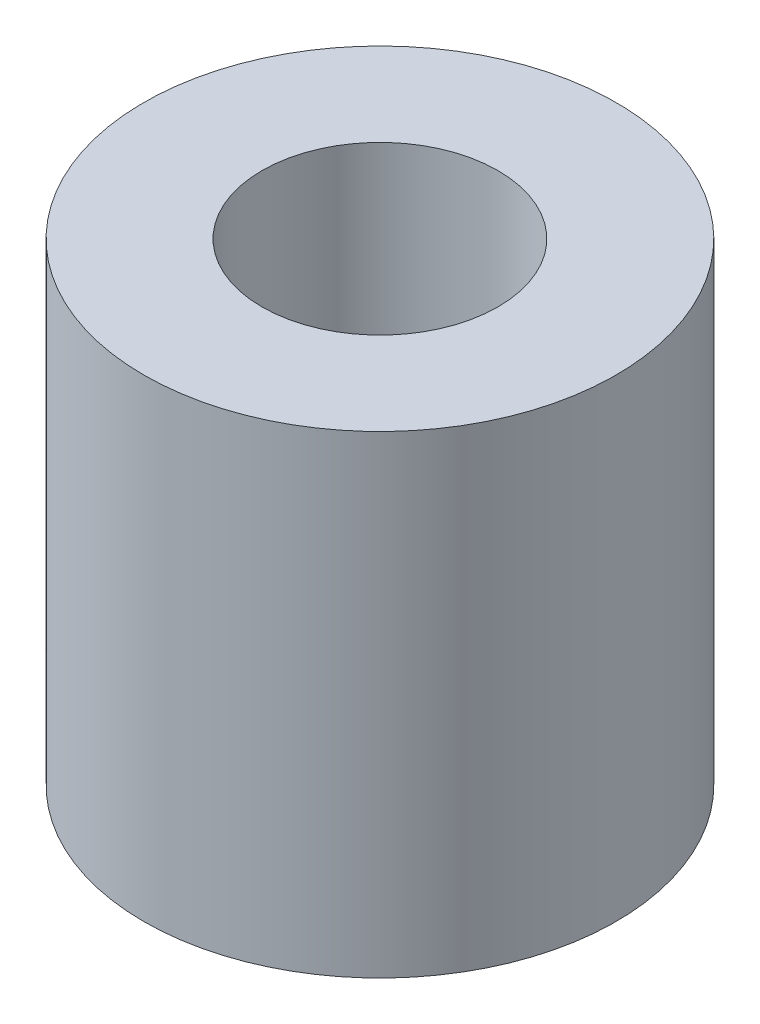
ISO-10303-21;
HEADER;
FILE_DESCRIPTION(('STEP AP214'),'2;1');
FILE_NAME('part.step','',(''),(''),'','','');
FILE_SCHEMA(('AUTOMOTIVE_DESIGN { 1 0 10303 214 1 1 1 1 }'));
ENDSEC;
DATA;
#1=APPLICATION_CONTEXT('core data for automotive mechanical design processes');
#2=APPLICATION_PROTOCOL_DEFINITION('international standard','automotive_design',2000,#1);
#3=PRODUCT_CONTEXT('',#1,'mechanical');
#4=PRODUCT('Part','Part','',(#3));
#5=PRODUCT_RELATED_PRODUCT_CATEGORY('part','',(#4));
#6=PRODUCT_DEFINITION_FORMATION('','',#4);
#7=PRODUCT_DEFINITION_CONTEXT('part definition',#1,'design');
#8=PRODUCT_DEFINITION('design','',#6,#7);
#9=PRODUCT_DEFINITION_SHAPE('','',#8);
#10=(LENGTH_UNIT() NAMED_UNIT(*) SI_UNIT(.MILLI.,.METRE.));
#11=(NAMED_UNIT(*) PLANE_ANGLE_UNIT() SI_UNIT($,.RADIAN.));
#12=(NAMED_UNIT(*) SI_UNIT($,.STERADIAN.) SOLID_ANGLE_UNIT());
#13=UNCERTAINTY_MEASURE_WITH_UNIT(LENGTH_MEASURE(1.E-05),#10,'distance_accuracy_value','');
#14=(GEOMETRIC_REPRESENTATION_CONTEXT(3) GLOBAL_UNCERTAINTY_ASSIGNED_CONTEXT((#13)) GLOBAL_UNIT_ASSIGNED_CONTEXT((#10,
#11,#12)) REPRESENTATION_CONTEXT('',''));
#15=CARTESIAN_POINT('',(0.,0.,0.));
#16=DIRECTION('',(0.,0.,1.));
#17=DIRECTION('',(1.,0.,0.));
#18=AXIS2_PLACEMENT_3D('',#15,#16,#17);
#19=CARTESIAN_POINT('',(0.,4.00982222,0.));
#20=DIRECTION('',(0.,1.,0.));
#21=DIRECTION('',(0.,0.,1.));
#22=AXIS2_PLACEMENT_3D('',#19,#20,#21);
#23=PLANE('',#22);
#24=CARTESIAN_POINT('',(0.,4.00982222,0.));
#25=DIRECTION('',(0.,1.,0.));
#26=DIRECTION('',(0.,0.,1.));
#27=AXIS2_PLACEMENT_3D('',#24,#25,#26);
#28=CIRCLE('',#27,4.);
#29=CARTESIAN_POINT('',(0.,4.00982222,4.));
#30=VERTEX_POINT('',#29);
#31=EDGE_CURVE('E10',#30,#30,#28,.T.);
#32=ORIENTED_EDGE('',*,*,#31,.T.);
#33=EDGE_LOOP('',(#32));
#34=FACE_BOUND('',#33,.T.);
#35=CARTESIAN_POINT('',(0.,4.00982222,0.));
#36=DIRECTION('',(0.,1.,0.));
#37=DIRECTION('',(0.,0.,1.));
#38=AXIS2_PLACEMENT_3D('',#35,#36,#37);
#39=CIRCLE('',#38,2.);
#40=CARTESIAN_POINT('',(0.,4.00982222,2.));
#41=VERTEX_POINT('',#40);
#42=EDGE_CURVE('E41',#41,#41,#39,.T.);
#43=ORIENTED_EDGE('',*,*,#42,.F.);
#44=EDGE_LOOP('',(#43));
#45=FACE_BOUND('',#44,.T.);
#46=ADVANCED_FACE('F30',(#34,#45),#23,.T.);
#47=CARTESIAN_POINT('',(0.,-4.00982222,0.));
#48=DIRECTION('',(0.,1.,0.));
#49=DIRECTION('',(0.,0.,1.));
#50=AXIS2_PLACEMENT_3D('',#47,#48,#49);
#51=PLANE('',#50);
#52=CARTESIAN_POINT('',(0.,-4.00982222,0.));
#53=DIRECTION('',(0.,1.,0.));
#54=DIRECTION('',(0.,0.,1.));
#55=AXIS2_PLACEMENT_3D('',#52,#53,#54);
#56=CIRCLE('',#55,4.);
#57=CARTESIAN_POINT('',(0.,-4.00982222,4.));
#58=VERTEX_POINT('',#57);
#59=EDGE_CURVE('E34',#58,#58,#56,.T.);
#60=ORIENTED_EDGE('',*,*,#59,.F.);
#61=EDGE_LOOP('',(#60));
#62=FACE_BOUND('',#61,.T.);
#63=CARTESIAN_POINT('',(0.,-4.00982222,0.));
#64=DIRECTION('',(0.,1.,0.));
#65=DIRECTION('',(0.,0.,1.));
#66=AXIS2_PLACEMENT_3D('',#63,#64,#65);
#67=CIRCLE('',#66,2.);
#68=CARTESIAN_POINT('',(0.,-4.00982222,2.));
#69=VERTEX_POINT('',#68);
#70=EDGE_CURVE('E43',#69,#69,#67,.T.);
#71=ORIENTED_EDGE('',*,*,#70,.T.);
#72=EDGE_LOOP('',(#71));
#73=FACE_BOUND('',#72,.T.);
#74=ADVANCED_FACE('F53',(#62,#73),#51,.F.);
#75=CARTESIAN_POINT('',(0.,4.00982222,0.));
#76=DIRECTION('',(0.,-1.,0.));
#77=DIRECTION('',(0.,0.,-1.));
#78=AXIS2_PLACEMENT_3D('',#75,#76,#77);
#79=CYLINDRICAL_SURFACE('',#78,4.);
#80=ORIENTED_EDGE('',*,*,#31,.F.);
#81=EDGE_LOOP('',(#80));
#82=FACE_BOUND('',#81,.T.);
#83=ORIENTED_EDGE('',*,*,#59,.T.);
#84=EDGE_LOOP('',(#83));
#85=FACE_BOUND('',#84,.T.);
#86=ADVANCED_FACE('F32',(#82,#85),#79,.T.);
#87=CARTESIAN_POINT('',(0.,4.00982222,0.));
#88=DIRECTION('',(0.,-1.,0.));
#89=DIRECTION('',(0.,0.,-1.));
#90=AXIS2_PLACEMENT_3D('',#87,#88,#89);
#91=CYLINDRICAL_SURFACE('',#90,2.);
#92=ORIENTED_EDGE('',*,*,#42,.T.);
#93=EDGE_LOOP('',(#92));
#94=FACE_BOUND('',#93,.T.);
#95=ORIENTED_EDGE('',*,*,#70,.F.);
#96=EDGE_LOOP('',(#95));
#97=FACE_BOUND('',#96,.T.);
#98=ADVANCED_FACE('F49',(#94,#97),#91,.F.);
#99=CLOSED_SHELL('',(#46,#74,#86,#98));
#100=MANIFOLD_SOLID_BREP('B2',#99);
#101=ADVANCED_BREP_SHAPE_REPRESENTATION('',(#18,#100),#14);
#102=SHAPE_DEFINITION_REPRESENTATION(#9,#101);
ENDSEC;
END-ISO-10303-21;
